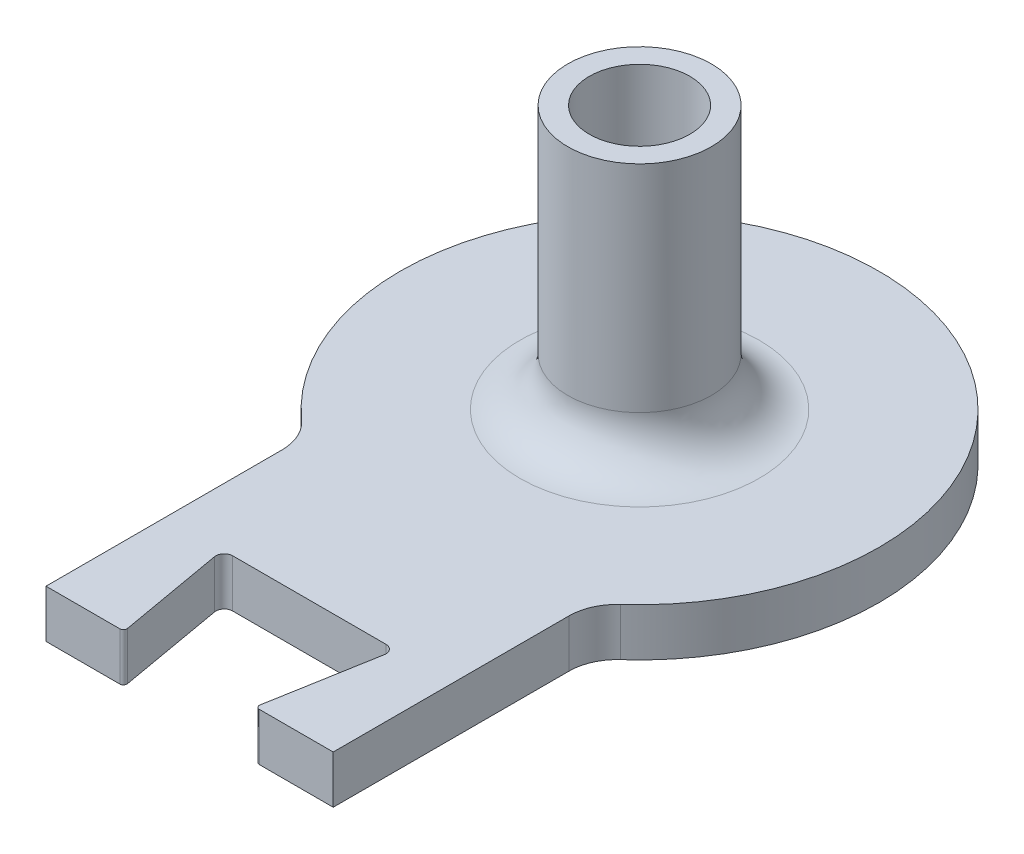
ISO-10303-21;
HEADER;
FILE_DESCRIPTION(('STEP AP214'),'2;1');
FILE_NAME('part.step','',(''),(''),'','','');
FILE_SCHEMA(('AUTOMOTIVE_DESIGN { 1 0 10303 214 1 1 1 1 }'));
ENDSEC;
DATA;
#1=APPLICATION_CONTEXT('core data for automotive mechanical design processes');
#2=APPLICATION_PROTOCOL_DEFINITION('international standard','automotive_design',2000,#1);
#3=PRODUCT_CONTEXT('',#1,'mechanical');
#4=PRODUCT('Part','Part','',(#3));
#5=PRODUCT_RELATED_PRODUCT_CATEGORY('part','',(#4));
#6=PRODUCT_DEFINITION_FORMATION('','',#4);
#7=PRODUCT_DEFINITION_CONTEXT('part definition',#1,'design');
#8=PRODUCT_DEFINITION('design','',#6,#7);
#9=PRODUCT_DEFINITION_SHAPE('','',#8);
#10=(LENGTH_UNIT() NAMED_UNIT(*) SI_UNIT(.MILLI.,.METRE.));
#11=(NAMED_UNIT(*) PLANE_ANGLE_UNIT() SI_UNIT($,.RADIAN.));
#12=(NAMED_UNIT(*) SI_UNIT($,.STERADIAN.) SOLID_ANGLE_UNIT());
#13=UNCERTAINTY_MEASURE_WITH_UNIT(LENGTH_MEASURE(1.E-05),#10,'distance_accuracy_value','');
#14=(GEOMETRIC_REPRESENTATION_CONTEXT(3) GLOBAL_UNCERTAINTY_ASSIGNED_CONTEXT((#13)) GLOBAL_UNIT_ASSIGNED_CONTEXT((#10,
#11,#12)) REPRESENTATION_CONTEXT('',''));
#15=CARTESIAN_POINT('',(0.,0.,0.));
#16=DIRECTION('',(0.,0.,1.));
#17=DIRECTION('',(1.,0.,0.));
#18=AXIS2_PLACEMENT_3D('',#15,#16,#17);
#19=CARTESIAN_POINT('',(0.,2.,0.));
#20=DIRECTION('',(0.,1.,0.));
#21=DIRECTION('',(0.,0.,1.));
#22=AXIS2_PLACEMENT_3D('',#19,#20,#21);
#23=PLANE('',#22);
#24=CARTESIAN_POINT('',(0.,2.,0.));
#25=DIRECTION('',(0.,1.,0.));
#26=DIRECTION('',(0.,0.,1.));
#27=AXIS2_PLACEMENT_3D('',#24,#25,#26);
#28=CIRCLE('',#27,5.);
#29=CARTESIAN_POINT('',(0.,2.,5.));
#30=VERTEX_POINT('',#29);
#31=EDGE_CURVE('E209',#30,#30,#28,.F.);
#32=ORIENTED_EDGE('',*,*,#31,.T.);
#33=EDGE_LOOP('',(#32));
#34=FACE_BOUND('',#33,.T.);
#35=DIRECTION('',(-0.173648177666934,0.,0.984807753012207));
#36=VECTOR('',#35,1.);
#37=CARTESIAN_POINT('',(2.70227505957538,2.,19.));
#38=LINE('',#37,#36);
#39=CARTESIAN_POINT('',(3.54674431540572,2.,14.2107768621834));
#40=VERTEX_POINT('',#39);
#41=CARTESIAN_POINT('',(2.76858233165438,2.,18.62395277335));
#42=VERTEX_POINT('',#41);
#43=EDGE_CURVE('E152',#40,#42,#38,.T.);
#44=ORIENTED_EDGE('',*,*,#43,.T.);
#45=CARTESIAN_POINT('',(2.91630349460621,2.,18.65));
#46=DIRECTION('',(0.,1.,0.));
#47=DIRECTION('',(0.,0.,1.));
#48=AXIS2_PLACEMENT_3D('',#45,#46,#47);
#49=CIRCLE('',#48,0.15);
#50=CARTESIAN_POINT('',(2.91630349460621,2.,18.8));
#51=VERTEX_POINT('',#50);
#52=EDGE_CURVE('E147',#42,#51,#49,.T.);
#53=ORIENTED_EDGE('',*,*,#52,.T.);
#54=DIRECTION('',(-1.,0.,0.));
#55=VECTOR('',#54,1.);
#56=CARTESIAN_POINT('',(-6.,2.,18.8));
#57=LINE('',#56,#55);
#58=CARTESIAN_POINT('',(6.,2.,18.8));
#59=VERTEX_POINT('',#58);
#60=EDGE_CURVE('E137',#59,#51,#57,.T.);
#61=ORIENTED_EDGE('',*,*,#60,.F.);
#62=DIRECTION('',(0.,0.,-1.));
#63=VECTOR('',#62,1.);
#64=CARTESIAN_POINT('',(6.,2.,19.));
#65=LINE('',#64,#63);
#66=CARTESIAN_POINT('',(6.,2.,8.94427190999916));
#67=VERTEX_POINT('',#66);
#68=EDGE_CURVE('E145',#59,#67,#65,.T.);
#69=ORIENTED_EDGE('',*,*,#68,.T.);
#70=CARTESIAN_POINT('',(8.,2.,8.94427190999916));
#71=DIRECTION('',(0.,1.,0.));
#72=DIRECTION('',(0.,0.,1.));
#73=AXIS2_PLACEMENT_3D('',#70,#71,#72);
#74=CIRCLE('',#73,2.);
#75=CARTESIAN_POINT('',(6.66666666666667,2.,7.4535599249993));
#76=VERTEX_POINT('',#75);
#77=EDGE_CURVE('E11',#67,#76,#74,.F.);
#78=ORIENTED_EDGE('',*,*,#77,.T.);
#79=CARTESIAN_POINT('',(0.,2.,0.));
#80=DIRECTION('',(0.,1.,0.));
#81=DIRECTION('',(0.,0.,1.));
#82=AXIS2_PLACEMENT_3D('',#79,#80,#81);
#83=CIRCLE('',#82,10.);
#84=CARTESIAN_POINT('',(-6.66666666666667,2.,7.4535599249993));
#85=VERTEX_POINT('',#84);
#86=EDGE_CURVE('E241',#76,#85,#83,.T.);
#87=ORIENTED_EDGE('',*,*,#86,.T.);
#88=CARTESIAN_POINT('',(-8.,2.,8.94427190999916));
#89=DIRECTION('',(0.,1.,0.));
#90=DIRECTION('',(0.,0.,1.));
#91=AXIS2_PLACEMENT_3D('',#88,#89,#90);
#92=CIRCLE('',#91,2.);
#93=CARTESIAN_POINT('',(-6.,2.,8.94427190999916));
#94=VERTEX_POINT('',#93);
#95=EDGE_CURVE('E224',#85,#94,#92,.F.);
#96=ORIENTED_EDGE('',*,*,#95,.T.);
#97=DIRECTION('',(0.,0.,1.));
#98=VECTOR('',#97,1.);
#99=CARTESIAN_POINT('',(-6.,2.,-6.));
#100=LINE('',#99,#98);
#101=CARTESIAN_POINT('',(-6.,2.,18.8));
#102=VERTEX_POINT('',#101);
#103=EDGE_CURVE('E173',#94,#102,#100,.T.);
#104=ORIENTED_EDGE('',*,*,#103,.T.);
#105=CARTESIAN_POINT('',(-2.91630349460621,2.,18.8));
#106=VERTEX_POINT('',#105);
#107=EDGE_CURVE('E148',#106,#102,#57,.T.);
#108=ORIENTED_EDGE('',*,*,#107,.F.);
#109=CARTESIAN_POINT('',(-2.91630349460621,2.,18.65));
#110=DIRECTION('',(0.,1.,0.));
#111=DIRECTION('',(0.,0.,1.));
#112=AXIS2_PLACEMENT_3D('',#109,#110,#111);
#113=CIRCLE('',#112,0.15);
#114=CARTESIAN_POINT('',(-2.76858233165438,2.,18.62395277335));
#115=VERTEX_POINT('',#114);
#116=EDGE_CURVE('E194',#106,#115,#113,.T.);
#117=ORIENTED_EDGE('',*,*,#116,.T.);
#118=DIRECTION('',(-0.173648177666935,0.,-0.984807753012207));
#119=VECTOR('',#118,1.);
#120=CARTESIAN_POINT('',(-2.70227505957538,2.,19.));
#121=LINE('',#120,#119);
#122=CARTESIAN_POINT('',(-3.54674431540572,2.,14.2107768621834));
#123=VERTEX_POINT('',#122);
#124=EDGE_CURVE('E252',#115,#123,#121,.T.);
#125=ORIENTED_EDGE('',*,*,#124,.T.);
#126=CARTESIAN_POINT('',(-3.20206160185145,2.,14.15));
#127=DIRECTION('',(0.,1.,0.));
#128=DIRECTION('',(0.,0.,1.));
#129=AXIS2_PLACEMENT_3D('',#126,#127,#128);
#130=CIRCLE('',#129,0.35);
#131=CARTESIAN_POINT('',(-3.20206160185145,2.,13.8));
#132=VERTEX_POINT('',#131);
#133=EDGE_CURVE('E189',#123,#132,#130,.F.);
#134=ORIENTED_EDGE('',*,*,#133,.T.);
#135=DIRECTION('',(1.,0.,0.));
#136=VECTOR('',#135,1.);
#137=CARTESIAN_POINT('',(-3.61917535925942,2.,13.8));
#138=LINE('',#137,#136);
#139=CARTESIAN_POINT('',(3.20206160185144,2.,13.8));
#140=VERTEX_POINT('',#139);
#141=EDGE_CURVE('E157',#132,#140,#138,.T.);
#142=ORIENTED_EDGE('',*,*,#141,.T.);
#143=CARTESIAN_POINT('',(3.20206160185145,2.,14.15));
#144=DIRECTION('',(0.,1.,0.));
#145=DIRECTION('',(0.,0.,1.));
#146=AXIS2_PLACEMENT_3D('',#143,#144,#145);
#147=CIRCLE('',#146,0.35);
#148=EDGE_CURVE('E184',#140,#40,#147,.F.);
#149=ORIENTED_EDGE('',*,*,#148,.T.);
#150=EDGE_LOOP('',(#44,#53,#61,#69,#78,#87,#96,#104,#108,#117,#125,#134,#142,#149));
#151=FACE_BOUND('',#150,.T.);
#152=ADVANCED_FACE('F33',(#34,#151),#23,.T.);
#153=CARTESIAN_POINT('',(-6.,2.,13.2915026221292));
#154=DIRECTION('',(1.,0.,0.));
#155=DIRECTION('',(0.,0.,-1.));
#156=AXIS2_PLACEMENT_3D('',#153,#154,#155);
#157=PLANE('',#156);
#158=ORIENTED_EDGE('',*,*,#103,.F.);
#159=DIRECTION('',(0.,1.,0.));
#160=VECTOR('',#159,1.);
#161=CARTESIAN_POINT('',(-6.,0.,8.94427190999916));
#162=LINE('',#161,#160);
#163=CARTESIAN_POINT('',(-6.,0.,8.94427190999916));
#164=VERTEX_POINT('',#163);
#165=EDGE_CURVE('E221',#94,#164,#162,.F.);
#166=ORIENTED_EDGE('',*,*,#165,.T.);
#167=DIRECTION('',(0.,0.,1.));
#168=VECTOR('',#167,1.);
#169=CARTESIAN_POINT('',(-6.,0.,13.2915026221292));
#170=LINE('',#169,#168);
#171=CARTESIAN_POINT('',(-6.,0.,18.8));
#172=VERTEX_POINT('',#171);
#173=EDGE_CURVE('E161',#164,#172,#170,.T.);
#174=ORIENTED_EDGE('',*,*,#173,.T.);
#175=DIRECTION('',(0.,1.,0.));
#176=VECTOR('',#175,1.);
#177=CARTESIAN_POINT('',(-6.,-2.,18.8));
#178=LINE('',#177,#176);
#179=EDGE_CURVE('E141',#172,#102,#178,.T.);
#180=ORIENTED_EDGE('',*,*,#179,.T.);
#181=EDGE_LOOP('',(#158,#166,#174,#180));
#182=FACE_BOUND('',#181,.T.);
#183=ADVANCED_FACE('F250',(#182),#157,.F.);
#184=CARTESIAN_POINT('',(6.,2.,13.2915026221292));
#185=DIRECTION('',(-1.,0.,0.));
#186=DIRECTION('',(0.,0.,1.));
#187=AXIS2_PLACEMENT_3D('',#184,#185,#186);
#188=PLANE('',#187);
#189=DIRECTION('',(0.,0.,-1.));
#190=VECTOR('',#189,1.);
#191=CARTESIAN_POINT('',(6.,0.,13.2915026221292));
#192=LINE('',#191,#190);
#193=CARTESIAN_POINT('',(6.,0.,18.8));
#194=VERTEX_POINT('',#193);
#195=CARTESIAN_POINT('',(6.,0.,8.94427190999916));
#196=VERTEX_POINT('',#195);
#197=EDGE_CURVE('E172',#194,#196,#192,.T.);
#198=ORIENTED_EDGE('',*,*,#197,.T.);
#199=DIRECTION('',(0.,1.,0.));
#200=VECTOR('',#199,1.);
#201=CARTESIAN_POINT('',(6.,2.,8.94427190999916));
#202=LINE('',#201,#200);
#203=EDGE_CURVE('E54',#196,#67,#202,.T.);
#204=ORIENTED_EDGE('',*,*,#203,.T.);
#205=ORIENTED_EDGE('',*,*,#68,.F.);
#206=DIRECTION('',(0.,1.,0.));
#207=VECTOR('',#206,1.);
#208=CARTESIAN_POINT('',(6.,-2.,18.8));
#209=LINE('',#208,#207);
#210=EDGE_CURVE('E134',#194,#59,#209,.T.);
#211=ORIENTED_EDGE('',*,*,#210,.F.);
#212=EDGE_LOOP('',(#198,#204,#205,#211));
#213=FACE_BOUND('',#212,.T.);
#214=ADVANCED_FACE('F150',(#213),#188,.F.);
#215=CARTESIAN_POINT('',(0.,2.,0.));
#216=DIRECTION('',(0.,1.,0.));
#217=DIRECTION('',(0.,0.,1.));
#218=AXIS2_PLACEMENT_3D('',#215,#216,#217);
#219=CIRCLE('',#218,2.1);
#220=CARTESIAN_POINT('',(0.,2.,-2.1));
#221=VERTEX_POINT('',#220);
#222=EDGE_CURVE('E208',#221,#221,#219,.F.);
#223=ORIENTED_EDGE('',*,*,#222,.F.);
#224=EDGE_LOOP('',(#223));
#225=FACE_BOUND('',#224,.T.);
#226=CARTESIAN_POINT('',(0.,2.,0.));
#227=DIRECTION('',(0.,1.,0.));
#228=DIRECTION('',(0.,0.,1.));
#229=AXIS2_PLACEMENT_3D('',#226,#227,#228);
#230=CIRCLE('',#229,0.25);
#231=CARTESIAN_POINT('',(0.,2.,0.25));
#232=VERTEX_POINT('',#231);
#233=EDGE_CURVE('E164',#232,#232,#230,.T.);
#234=ORIENTED_EDGE('',*,*,#233,.F.);
#235=EDGE_LOOP('',(#234));
#236=FACE_BOUND('',#235,.T.);
#237=ADVANCED_FACE('F293',(#225,#236),#23,.T.);
#238=CARTESIAN_POINT('',(0.,0.,0.));
#239=DIRECTION('',(0.,1.,0.));
#240=DIRECTION('',(0.,0.,1.));
#241=AXIS2_PLACEMENT_3D('',#238,#239,#240);
#242=PLANE('',#241);
#243=CARTESIAN_POINT('',(0.,0.,0.));
#244=DIRECTION('',(0.,1.,0.));
#245=DIRECTION('',(0.,0.,1.));
#246=AXIS2_PLACEMENT_3D('',#243,#244,#245);
#247=CIRCLE('',#246,0.25);
#248=CARTESIAN_POINT('',(0.,0.,0.25));
#249=VERTEX_POINT('',#248);
#250=EDGE_CURVE('E256',#249,#249,#247,.T.);
#251=ORIENTED_EDGE('',*,*,#250,.T.);
#252=EDGE_LOOP('',(#251));
#253=FACE_BOUND('',#252,.T.);
#254=DIRECTION('',(-1.,0.,0.));
#255=VECTOR('',#254,1.);
#256=CARTESIAN_POINT('',(0.,0.,18.8));
#257=LINE('',#256,#255);
#258=CARTESIAN_POINT('',(2.91630349460621,0.,18.8));
#259=VERTEX_POINT('',#258);
#260=EDGE_CURVE('E140',#194,#259,#257,.T.);
#261=ORIENTED_EDGE('',*,*,#260,.T.);
#262=CARTESIAN_POINT('',(2.91630349460621,0.,18.65));
#263=DIRECTION('',(0.,1.,0.));
#264=DIRECTION('',(0.,0.,1.));
#265=AXIS2_PLACEMENT_3D('',#262,#263,#264);
#266=CIRCLE('',#265,0.15);
#267=CARTESIAN_POINT('',(2.76858233165438,0.,18.62395277335));
#268=VERTEX_POINT('',#267);
#269=EDGE_CURVE('E201',#259,#268,#266,.F.);
#270=ORIENTED_EDGE('',*,*,#269,.T.);
#271=DIRECTION('',(-0.173648177666934,0.,0.984807753012207));
#272=VECTOR('',#271,1.);
#273=CARTESIAN_POINT('',(2.70227505957538,0.,19.));
#274=LINE('',#273,#272);
#275=CARTESIAN_POINT('',(3.54674431540572,0.,14.2107768621834));
#276=VERTEX_POINT('',#275);
#277=EDGE_CURVE('E169',#276,#268,#274,.T.);
#278=ORIENTED_EDGE('',*,*,#277,.F.);
#279=CARTESIAN_POINT('',(3.20206160185145,0.,14.15));
#280=DIRECTION('',(0.,1.,0.));
#281=DIRECTION('',(0.,0.,1.));
#282=AXIS2_PLACEMENT_3D('',#279,#280,#281);
#283=CIRCLE('',#282,0.35);
#284=CARTESIAN_POINT('',(3.20206160185145,0.,13.8));
#285=VERTEX_POINT('',#284);
#286=EDGE_CURVE('E182',#276,#285,#283,.T.);
#287=ORIENTED_EDGE('',*,*,#286,.T.);
#288=DIRECTION('',(1.,0.,0.));
#289=VECTOR('',#288,1.);
#290=CARTESIAN_POINT('',(3.61917535925942,0.,13.8));
#291=LINE('',#290,#289);
#292=CARTESIAN_POINT('',(-3.20206160185144,0.,13.8));
#293=VERTEX_POINT('',#292);
#294=EDGE_CURVE('E166',#293,#285,#291,.T.);
#295=ORIENTED_EDGE('',*,*,#294,.F.);
#296=CARTESIAN_POINT('',(-3.20206160185145,0.,14.15));
#297=DIRECTION('',(0.,1.,0.));
#298=DIRECTION('',(0.,0.,1.));
#299=AXIS2_PLACEMENT_3D('',#296,#297,#298);
#300=CIRCLE('',#299,0.35);
#301=CARTESIAN_POINT('',(-3.54674431540572,0.,14.2107768621834));
#302=VERTEX_POINT('',#301);
#303=EDGE_CURVE('E186',#293,#302,#300,.T.);
#304=ORIENTED_EDGE('',*,*,#303,.T.);
#305=DIRECTION('',(-0.173648177666935,0.,-0.984807753012207));
#306=VECTOR('',#305,1.);
#307=CARTESIAN_POINT('',(-2.70227505957538,0.,19.));
#308=LINE('',#307,#306);
#309=CARTESIAN_POINT('',(-2.76858233165438,0.,18.62395277335));
#310=VERTEX_POINT('',#309);
#311=EDGE_CURVE('E163',#310,#302,#308,.T.);
#312=ORIENTED_EDGE('',*,*,#311,.F.);
#313=CARTESIAN_POINT('',(-2.91630349460621,0.,18.65));
#314=DIRECTION('',(0.,1.,0.));
#315=DIRECTION('',(0.,0.,1.));
#316=AXIS2_PLACEMENT_3D('',#313,#314,#315);
#317=CIRCLE('',#316,0.15);
#318=CARTESIAN_POINT('',(-2.91630349460621,0.,18.8));
#319=VERTEX_POINT('',#318);
#320=EDGE_CURVE('E199',#310,#319,#317,.F.);
#321=ORIENTED_EDGE('',*,*,#320,.T.);
#322=EDGE_CURVE('E242',#319,#172,#257,.T.);
#323=ORIENTED_EDGE('',*,*,#322,.T.);
#324=ORIENTED_EDGE('',*,*,#173,.F.);
#325=CARTESIAN_POINT('',(-8.,0.,8.94427190999916));
#326=DIRECTION('',(0.,1.,0.));
#327=DIRECTION('',(0.,0.,1.));
#328=AXIS2_PLACEMENT_3D('',#325,#326,#327);
#329=CIRCLE('',#328,2.);
#330=CARTESIAN_POINT('',(-6.66666666666667,0.,7.4535599249993));
#331=VERTEX_POINT('',#330);
#332=EDGE_CURVE('E226',#164,#331,#329,.T.);
#333=ORIENTED_EDGE('',*,*,#332,.T.);
#334=CARTESIAN_POINT('',(0.,0.,0.));
#335=DIRECTION('',(0.,1.,0.));
#336=DIRECTION('',(0.,0.,1.));
#337=AXIS2_PLACEMENT_3D('',#334,#335,#336);
#338=CIRCLE('',#337,10.);
#339=CARTESIAN_POINT('',(6.66666666666667,0.,7.4535599249993));
#340=VERTEX_POINT('',#339);
#341=EDGE_CURVE('E231',#340,#331,#338,.T.);
#342=ORIENTED_EDGE('',*,*,#341,.F.);
#343=CARTESIAN_POINT('',(8.,0.,8.94427190999916));
#344=DIRECTION('',(0.,1.,0.));
#345=DIRECTION('',(0.,0.,1.));
#346=AXIS2_PLACEMENT_3D('',#343,#344,#345);
#347=CIRCLE('',#346,2.);
#348=EDGE_CURVE('E41',#340,#196,#347,.T.);
#349=ORIENTED_EDGE('',*,*,#348,.T.);
#350=ORIENTED_EDGE('',*,*,#197,.F.);
#351=EDGE_LOOP('',(#261,#270,#278,#287,#295,#304,#312,#321,#323,#324,#333,#342,#349,#350));
#352=FACE_BOUND('',#351,.T.);
#353=ADVANCED_FACE('F230',(#253,#352),#242,.F.);
#354=CARTESIAN_POINT('',(-2.70227505957538,2.,19.));
#355=DIRECTION('',(-0.984807753012207,0.,0.173648177666935));
#356=DIRECTION('',(0.173648177666935,0.,0.984807753012207));
#357=AXIS2_PLACEMENT_3D('',#354,#355,#356);
#358=PLANE('',#357);
#359=ORIENTED_EDGE('',*,*,#124,.F.);
#360=DIRECTION('',(0.,-1.,0.));
#361=VECTOR('',#360,1.);
#362=CARTESIAN_POINT('',(-2.76858233165438,2.,18.62395277335));
#363=LINE('',#362,#361);
#364=EDGE_CURVE('E203',#115,#310,#363,.T.);
#365=ORIENTED_EDGE('',*,*,#364,.T.);
#366=ORIENTED_EDGE('',*,*,#311,.T.);
#367=DIRECTION('',(0.,-1.,0.));
#368=VECTOR('',#367,1.);
#369=CARTESIAN_POINT('',(-3.54674431540572,2.,14.2107768621834));
#370=LINE('',#369,#368);
#371=EDGE_CURVE('E179',#302,#123,#370,.F.);
#372=ORIENTED_EDGE('',*,*,#371,.T.);
#373=EDGE_LOOP('',(#359,#365,#366,#372));
#374=FACE_BOUND('',#373,.T.);
#375=ADVANCED_FACE('F306',(#374),#358,.F.);
#376=CARTESIAN_POINT('',(3.61917535925942,2.,13.8));
#377=DIRECTION('',(0.,0.,-1.));
#378=DIRECTION('',(-1.,0.,0.));
#379=AXIS2_PLACEMENT_3D('',#376,#377,#378);
#380=PLANE('',#379);
#381=ORIENTED_EDGE('',*,*,#294,.T.);
#382=DIRECTION('',(0.,-1.,0.));
#383=VECTOR('',#382,1.);
#384=CARTESIAN_POINT('',(3.20206160185145,2.,13.8));
#385=LINE('',#384,#383);
#386=EDGE_CURVE('E177',#285,#140,#385,.F.);
#387=ORIENTED_EDGE('',*,*,#386,.T.);
#388=ORIENTED_EDGE('',*,*,#141,.F.);
#389=DIRECTION('',(0.,-1.,0.));
#390=VECTOR('',#389,1.);
#391=CARTESIAN_POINT('',(-3.20206160185145,0.,13.8));
#392=LINE('',#391,#390);
#393=EDGE_CURVE('E155',#132,#293,#392,.T.);
#394=ORIENTED_EDGE('',*,*,#393,.T.);
#395=EDGE_LOOP('',(#381,#387,#388,#394));
#396=FACE_BOUND('',#395,.T.);
#397=ADVANCED_FACE('F351',(#396),#380,.F.);
#398=CARTESIAN_POINT('',(2.70227505957538,2.,19.));
#399=DIRECTION('',(0.984807753012207,0.,0.173648177666934));
#400=DIRECTION('',(0.173648177666934,0.,-0.984807753012207));
#401=AXIS2_PLACEMENT_3D('',#398,#399,#400);
#402=PLANE('',#401);
#403=ORIENTED_EDGE('',*,*,#277,.T.);
#404=DIRECTION('',(0.,1.,0.));
#405=VECTOR('',#404,1.);
#406=CARTESIAN_POINT('',(2.76858233165438,2.,18.62395277335));
#407=LINE('',#406,#405);
#408=EDGE_CURVE('E191',#268,#42,#407,.T.);
#409=ORIENTED_EDGE('',*,*,#408,.T.);
#410=ORIENTED_EDGE('',*,*,#43,.F.);
#411=DIRECTION('',(0.,-1.,0.));
#412=VECTOR('',#411,1.);
#413=CARTESIAN_POINT('',(3.54674431540572,0.,14.2107768621834));
#414=LINE('',#413,#412);
#415=EDGE_CURVE('E151',#40,#276,#414,.T.);
#416=ORIENTED_EDGE('',*,*,#415,.T.);
#417=EDGE_LOOP('',(#403,#409,#410,#416));
#418=FACE_BOUND('',#417,.T.);
#419=ADVANCED_FACE('F271',(#418),#402,.F.);
#420=CARTESIAN_POINT('',(0.,2.,0.));
#421=DIRECTION('',(0.,-1.,0.));
#422=DIRECTION('',(0.,0.,-1.));
#423=AXIS2_PLACEMENT_3D('',#420,#421,#422);
#424=CYLINDRICAL_SURFACE('',#423,0.25);
#425=ORIENTED_EDGE('',*,*,#233,.T.);
#426=EDGE_LOOP('',(#425));
#427=FACE_BOUND('',#426,.T.);
#428=ORIENTED_EDGE('',*,*,#250,.F.);
#429=EDGE_LOOP('',(#428));
#430=FACE_BOUND('',#429,.T.);
#431=ADVANCED_FACE('F346',(#427,#430),#424,.F.);
#432=CARTESIAN_POINT('',(0.,2.,0.));
#433=DIRECTION('',(0.,-1.,0.));
#434=DIRECTION('',(0.,0.,-1.));
#435=AXIS2_PLACEMENT_3D('',#432,#433,#434);
#436=CYLINDRICAL_SURFACE('',#435,10.);
#437=ORIENTED_EDGE('',*,*,#341,.T.);
#438=DIRECTION('',(0.,-1.,0.));
#439=VECTOR('',#438,1.);
#440=CARTESIAN_POINT('',(-6.66666666666667,2.,7.4535599249993));
#441=LINE('',#440,#439);
#442=EDGE_CURVE('E218',#331,#85,#441,.F.);
#443=ORIENTED_EDGE('',*,*,#442,.T.);
#444=ORIENTED_EDGE('',*,*,#86,.F.);
#445=DIRECTION('',(0.,-1.,0.));
#446=VECTOR('',#445,1.);
#447=CARTESIAN_POINT('',(6.66666666666667,2.,7.4535599249993));
#448=LINE('',#447,#446);
#449=EDGE_CURVE('E215',#76,#340,#448,.T.);
#450=ORIENTED_EDGE('',*,*,#449,.T.);
#451=EDGE_LOOP('',(#437,#443,#444,#450));
#452=FACE_BOUND('',#451,.T.);
#453=ADVANCED_FACE('F237',(#452),#436,.T.);
#454=CARTESIAN_POINT('',(-6.,-2.,18.8));
#455=DIRECTION('',(0.,0.,-1.));
#456=DIRECTION('',(-1.,0.,0.));
#457=AXIS2_PLACEMENT_3D('',#454,#455,#456);
#458=PLANE('',#457);
#459=ORIENTED_EDGE('',*,*,#60,.T.);
#460=DIRECTION('',(0.,1.,0.));
#461=VECTOR('',#460,1.);
#462=CARTESIAN_POINT('',(2.91630349460621,-2.,18.8));
#463=LINE('',#462,#461);
#464=EDGE_CURVE('E197',#51,#259,#463,.F.);
#465=ORIENTED_EDGE('',*,*,#464,.T.);
#466=ORIENTED_EDGE('',*,*,#260,.F.);
#467=ORIENTED_EDGE('',*,*,#210,.T.);
#468=EDGE_LOOP('',(#459,#465,#466,#467));
#469=FACE_BOUND('',#468,.T.);
#470=ADVANCED_FACE('F136',(#469),#458,.F.);
#471=ORIENTED_EDGE('',*,*,#322,.F.);
#472=DIRECTION('',(0.,-1.,0.));
#473=VECTOR('',#472,1.);
#474=CARTESIAN_POINT('',(-2.91630349460621,-2.,18.8));
#475=LINE('',#474,#473);
#476=EDGE_CURVE('E206',#319,#106,#475,.F.);
#477=ORIENTED_EDGE('',*,*,#476,.T.);
#478=ORIENTED_EDGE('',*,*,#107,.T.);
#479=ORIENTED_EDGE('',*,*,#179,.F.);
#480=EDGE_LOOP('',(#471,#477,#478,#479));
#481=FACE_BOUND('',#480,.T.);
#482=ADVANCED_FACE('F341',(#481),#458,.F.);
#483=CARTESIAN_POINT('',(3.20206160185145,2.,14.15));
#484=DIRECTION('',(0.,1.,0.));
#485=DIRECTION('',(0.,0.,1.));
#486=AXIS2_PLACEMENT_3D('',#483,#484,#485);
#487=CYLINDRICAL_SURFACE('',#486,0.35);
#488=ORIENTED_EDGE('',*,*,#148,.F.);
#489=ORIENTED_EDGE('',*,*,#386,.F.);
#490=ORIENTED_EDGE('',*,*,#286,.F.);
#491=ORIENTED_EDGE('',*,*,#415,.F.);
#492=EDGE_LOOP('',(#488,#489,#490,#491));
#493=FACE_BOUND('',#492,.T.);
#494=ADVANCED_FACE('F268',(#493),#487,.F.);
#495=CARTESIAN_POINT('',(-3.20206160185145,2.,14.15));
#496=DIRECTION('',(0.,1.,0.));
#497=DIRECTION('',(0.,0.,1.));
#498=AXIS2_PLACEMENT_3D('',#495,#496,#497);
#499=CYLINDRICAL_SURFACE('',#498,0.35);
#500=ORIENTED_EDGE('',*,*,#133,.F.);
#501=ORIENTED_EDGE('',*,*,#371,.F.);
#502=ORIENTED_EDGE('',*,*,#303,.F.);
#503=ORIENTED_EDGE('',*,*,#393,.F.);
#504=EDGE_LOOP('',(#500,#501,#502,#503));
#505=FACE_BOUND('',#504,.T.);
#506=ADVANCED_FACE('F279',(#505),#499,.F.);
#507=CARTESIAN_POINT('',(2.91630349460621,2.,18.65));
#508=DIRECTION('',(0.,1.,0.));
#509=DIRECTION('',(0.,0.,1.));
#510=AXIS2_PLACEMENT_3D('',#507,#508,#509);
#511=CYLINDRICAL_SURFACE('',#510,0.15);
#512=ORIENTED_EDGE('',*,*,#269,.F.);
#513=ORIENTED_EDGE('',*,*,#464,.F.);
#514=ORIENTED_EDGE('',*,*,#52,.F.);
#515=ORIENTED_EDGE('',*,*,#408,.F.);
#516=EDGE_LOOP('',(#512,#513,#514,#515));
#517=FACE_BOUND('',#516,.T.);
#518=ADVANCED_FACE('F276',(#517),#511,.T.);
#519=CARTESIAN_POINT('',(-2.91630349460621,2.,18.65));
#520=DIRECTION('',(0.,-1.,0.));
#521=DIRECTION('',(0.,0.,-1.));
#522=AXIS2_PLACEMENT_3D('',#519,#520,#521);
#523=CYLINDRICAL_SURFACE('',#522,0.15);
#524=ORIENTED_EDGE('',*,*,#116,.F.);
#525=ORIENTED_EDGE('',*,*,#476,.F.);
#526=ORIENTED_EDGE('',*,*,#320,.F.);
#527=ORIENTED_EDGE('',*,*,#364,.F.);
#528=EDGE_LOOP('',(#524,#525,#526,#527));
#529=FACE_BOUND('',#528,.T.);
#530=ADVANCED_FACE('F278',(#529),#523,.T.);
#531=CARTESIAN_POINT('',(0.,13.,0.));
#532=DIRECTION('',(0.,1.,0.));
#533=DIRECTION('',(0.,0.,1.));
#534=AXIS2_PLACEMENT_3D('',#531,#532,#533);
#535=PLANE('',#534);
#536=CARTESIAN_POINT('',(0.,13.,0.));
#537=DIRECTION('',(0.,1.,0.));
#538=DIRECTION('',(0.,0.,1.));
#539=AXIS2_PLACEMENT_3D('',#536,#537,#538);
#540=CIRCLE('',#539,3.);
#541=CARTESIAN_POINT('',(0.,13.,-3.));
#542=VERTEX_POINT('',#541);
#543=EDGE_CURVE('E321',#542,#542,#540,.T.);
#544=ORIENTED_EDGE('',*,*,#543,.T.);
#545=EDGE_LOOP('',(#544));
#546=FACE_BOUND('',#545,.T.);
#547=CARTESIAN_POINT('',(0.,13.,0.));
#548=DIRECTION('',(0.,1.,0.));
#549=DIRECTION('',(0.,0.,1.));
#550=AXIS2_PLACEMENT_3D('',#547,#548,#549);
#551=CIRCLE('',#550,2.1);
#552=CARTESIAN_POINT('',(0.,13.,-2.1));
#553=VERTEX_POINT('',#552);
#554=EDGE_CURVE('E324',#553,#553,#551,.T.);
#555=ORIENTED_EDGE('',*,*,#554,.F.);
#556=EDGE_LOOP('',(#555));
#557=FACE_BOUND('',#556,.T.);
#558=ADVANCED_FACE('F285',(#546,#557),#535,.T.);
#559=CARTESIAN_POINT('',(0.,13.,0.));
#560=DIRECTION('',(0.,-1.,0.));
#561=DIRECTION('',(0.,0.,-1.));
#562=AXIS2_PLACEMENT_3D('',#559,#560,#561);
#563=CYLINDRICAL_SURFACE('',#562,3.);
#564=CARTESIAN_POINT('',(0.,4.,0.));
#565=DIRECTION('',(0.,1.,0.));
#566=DIRECTION('',(0.,0.,1.));
#567=AXIS2_PLACEMENT_3D('',#564,#565,#566);
#568=CIRCLE('',#567,3.);
#569=CARTESIAN_POINT('',(0.,4.,-3.));
#570=VERTEX_POINT('',#569);
#571=EDGE_CURVE('E212',#570,#570,#568,.T.);
#572=CARTESIAN_POINT('',(0.,4.,-3.));
#573=CARTESIAN_POINT('',(0.,4.09375,-3.));
#574=CARTESIAN_POINT('',(0.,4.1875,-3.));
#575=CARTESIAN_POINT('',(0.,4.375,-3.));
#576=CARTESIAN_POINT('',(0.,4.46875,-3.));
#577=CARTESIAN_POINT('',(0.,4.65625,-3.));
#578=CARTESIAN_POINT('',(0.,4.75,-3.));
#579=CARTESIAN_POINT('',(0.,4.9375,-3.));
#580=CARTESIAN_POINT('',(0.,5.03125,-3.));
#581=CARTESIAN_POINT('',(0.,5.21875,-3.));
#582=CARTESIAN_POINT('',(0.,5.3125,-3.));
#583=CARTESIAN_POINT('',(0.,5.5,-3.));
#584=CARTESIAN_POINT('',(0.,5.59375,-3.));
#585=CARTESIAN_POINT('',(0.,5.78125,-3.));
#586=CARTESIAN_POINT('',(0.,5.875,-3.));
#587=CARTESIAN_POINT('',(0.,6.0625,-3.));
#588=CARTESIAN_POINT('',(0.,6.15625,-3.));
#589=CARTESIAN_POINT('',(0.,6.34375,-3.));
#590=CARTESIAN_POINT('',(0.,6.4375,-3.));
#591=CARTESIAN_POINT('',(0.,6.625,-3.));
#592=CARTESIAN_POINT('',(0.,6.71875,-3.));
#593=CARTESIAN_POINT('',(0.,6.90625,-3.));
#594=CARTESIAN_POINT('',(0.,7.,-3.));
#595=CARTESIAN_POINT('',(0.,7.1875,-3.));
#596=CARTESIAN_POINT('',(0.,7.28125,-3.));
#597=CARTESIAN_POINT('',(0.,7.46875,-3.));
#598=CARTESIAN_POINT('',(0.,7.5625,-3.));
#599=CARTESIAN_POINT('',(0.,7.75,-3.));
#600=CARTESIAN_POINT('',(0.,7.84375,-3.));
#601=CARTESIAN_POINT('',(0.,8.03125,-3.));
#602=CARTESIAN_POINT('',(0.,8.125,-3.));
#603=CARTESIAN_POINT('',(0.,8.3125,-3.));
#604=CARTESIAN_POINT('',(0.,8.40625,-3.));
#605=CARTESIAN_POINT('',(0.,8.59375,-3.));
#606=CARTESIAN_POINT('',(0.,8.6875,-3.));
#607=CARTESIAN_POINT('',(0.,8.875,-3.));
#608=CARTESIAN_POINT('',(0.,8.96875,-3.));
#609=CARTESIAN_POINT('',(0.,9.15625,-3.));
#610=CARTESIAN_POINT('',(0.,9.25,-3.));
#611=CARTESIAN_POINT('',(0.,9.4375,-3.));
#612=CARTESIAN_POINT('',(0.,9.53125,-3.));
#613=CARTESIAN_POINT('',(0.,9.71875,-3.));
#614=CARTESIAN_POINT('',(0.,9.8125,-3.));
#615=CARTESIAN_POINT('',(0.,10.,-3.));
#616=CARTESIAN_POINT('',(0.,10.09375,-3.));
#617=CARTESIAN_POINT('',(0.,10.28125,-3.));
#618=CARTESIAN_POINT('',(0.,10.375,-3.));
#619=CARTESIAN_POINT('',(0.,10.5625,-3.));
#620=CARTESIAN_POINT('',(0.,10.65625,-3.));
#621=CARTESIAN_POINT('',(0.,10.84375,-3.));
#622=CARTESIAN_POINT('',(0.,10.9375,-3.));
#623=CARTESIAN_POINT('',(0.,11.125,-3.));
#624=CARTESIAN_POINT('',(0.,11.21875,-3.));
#625=CARTESIAN_POINT('',(0.,11.40625,-3.));
#626=CARTESIAN_POINT('',(0.,11.5,-3.));
#627=CARTESIAN_POINT('',(0.,11.6875,-3.));
#628=CARTESIAN_POINT('',(0.,11.78125,-3.));
#629=CARTESIAN_POINT('',(0.,11.96875,-3.));
#630=CARTESIAN_POINT('',(0.,12.0625,-3.));
#631=CARTESIAN_POINT('',(0.,12.25,-3.));
#632=CARTESIAN_POINT('',(0.,12.34375,-3.));
#633=CARTESIAN_POINT('',(0.,12.53125,-3.));
#634=CARTESIAN_POINT('',(0.,12.625,-3.));
#635=CARTESIAN_POINT('',(0.,12.8125,-3.));
#636=CARTESIAN_POINT('',(0.,12.90625,-3.));
#637=CARTESIAN_POINT('',(0.,13.,-3.));
#638=B_SPLINE_CURVE_WITH_KNOTS('',3,(#572,#573,#574,#575,#576,#577,#578,#579,#580,#581,#582,
#583,#584,#585,#586,#587,#588,#589,#590,#591,#592,#593,#594,#595,#596,#597,#598,#599,#600,#601,
#602,#603,#604,#605,#606,#607,#608,#609,#610,#611,#612,#613,#614,#615,#616,#617,#618,#619,#620,
#621,#622,#623,#624,#625,#626,#627,#628,#629,#630,#631,#632,#633,#634,#635,#636,#637),
.UNSPECIFIED.,.F.,.F.,(4,2,2,2,2,2,2,2,2,2,2,2,2,2,2,2,2,2,2,2,2,2,2,2,2,2,2,2,2,2,2,2,4),(0.,
0.28125,0.5625,0.843750000000001,1.125,1.40625,1.6875,1.96875,2.25,2.53125,2.8125,3.09375,3.375,
3.65625,3.9375,4.21875,4.5,4.78125,5.0625,5.34375,5.625,5.90625,6.1875,6.46875,6.75,7.03125,
7.3125,7.59375,7.875,8.15625,8.4375,8.71875,9.),.UNSPECIFIED.);
#639=EDGE_CURVE('BSEAM331',#570,#542,#638,.T.);
#640=ORIENTED_EDGE('',*,*,#571,.T.);
#641=ORIENTED_EDGE('',*,*,#543,.F.);
#642=ORIENTED_EDGE('',*,*,#639,.T.);
#643=ORIENTED_EDGE('',*,*,#639,.F.);
#644=EDGE_LOOP('',(#640,#642,#641,#643));
#645=FACE_BOUND('',#644,.T.);
#646=ADVANCED_FACE('F331',(#645),#563,.T.);
#647=CARTESIAN_POINT('',(0.,13.,0.));
#648=DIRECTION('',(0.,-1.,0.));
#649=DIRECTION('',(0.,0.,-1.));
#650=AXIS2_PLACEMENT_3D('',#647,#648,#649);
#651=CYLINDRICAL_SURFACE('',#650,2.1);
#652=CARTESIAN_POINT('',(0.,2.,-2.1));
#653=CARTESIAN_POINT('',(0.,2.11458333333333,-2.1));
#654=CARTESIAN_POINT('',(0.,2.22916666666667,-2.1));
#655=CARTESIAN_POINT('',(0.,2.45833333333333,-2.1));
#656=CARTESIAN_POINT('',(0.,2.57291666666667,-2.1));
#657=CARTESIAN_POINT('',(0.,2.80208333333333,-2.1));
#658=CARTESIAN_POINT('',(0.,2.91666666666667,-2.1));
#659=CARTESIAN_POINT('',(0.,3.14583333333333,-2.1));
#660=CARTESIAN_POINT('',(0.,3.26041666666666,-2.1));
#661=CARTESIAN_POINT('',(0.,3.48958333333333,-2.1));
#662=CARTESIAN_POINT('',(0.,3.60416666666666,-2.1));
#663=CARTESIAN_POINT('',(0.,3.83333333333333,-2.1));
#664=CARTESIAN_POINT('',(0.,3.94791666666666,-2.1));
#665=CARTESIAN_POINT('',(0.,4.17708333333333,-2.1));
#666=CARTESIAN_POINT('',(0.,4.29166666666667,-2.1));
#667=CARTESIAN_POINT('',(0.,4.52083333333333,-2.1));
#668=CARTESIAN_POINT('',(0.,4.63541666666667,-2.1));
#669=CARTESIAN_POINT('',(0.,4.86458333333333,-2.1));
#670=CARTESIAN_POINT('',(0.,4.97916666666666,-2.1));
#671=CARTESIAN_POINT('',(0.,5.20833333333333,-2.1));
#672=CARTESIAN_POINT('',(0.,5.32291666666666,-2.1));
#673=CARTESIAN_POINT('',(0.,5.55208333333333,-2.1));
#674=CARTESIAN_POINT('',(0.,5.66666666666666,-2.1));
#675=CARTESIAN_POINT('',(0.,5.89583333333333,-2.1));
#676=CARTESIAN_POINT('',(0.,6.01041666666666,-2.1));
#677=CARTESIAN_POINT('',(0.,6.23958333333333,-2.1));
#678=CARTESIAN_POINT('',(0.,6.35416666666666,-2.1));
#679=CARTESIAN_POINT('',(0.,6.58333333333333,-2.1));
#680=CARTESIAN_POINT('',(0.,6.69791666666666,-2.1));
#681=CARTESIAN_POINT('',(0.,6.92708333333333,-2.1));
#682=CARTESIAN_POINT('',(0.,7.04166666666667,-2.1));
#683=CARTESIAN_POINT('',(0.,7.27083333333333,-2.1));
#684=CARTESIAN_POINT('',(0.,7.38541666666666,-2.1));
#685=CARTESIAN_POINT('',(0.,7.61458333333333,-2.1));
#686=CARTESIAN_POINT('',(0.,7.72916666666666,-2.1));
#687=CARTESIAN_POINT('',(0.,7.95833333333333,-2.1));
#688=CARTESIAN_POINT('',(0.,8.07291666666666,-2.1));
#689=CARTESIAN_POINT('',(0.,8.30208333333333,-2.1));
#690=CARTESIAN_POINT('',(0.,8.41666666666666,-2.1));
#691=CARTESIAN_POINT('',(0.,8.64583333333333,-2.1));
#692=CARTESIAN_POINT('',(0.,8.76041666666666,-2.1));
#693=CARTESIAN_POINT('',(0.,8.98958333333333,-2.1));
#694=CARTESIAN_POINT('',(0.,9.10416666666666,-2.1));
#695=CARTESIAN_POINT('',(0.,9.33333333333333,-2.1));
#696=CARTESIAN_POINT('',(0.,9.44791666666667,-2.1));
#697=CARTESIAN_POINT('',(0.,9.67708333333333,-2.1));
#698=CARTESIAN_POINT('',(0.,9.79166666666666,-2.1));
#699=CARTESIAN_POINT('',(0.,10.0208333333333,-2.1));
#700=CARTESIAN_POINT('',(0.,10.1354166666667,-2.1));
#701=CARTESIAN_POINT('',(0.,10.3645833333333,-2.1));
#702=CARTESIAN_POINT('',(0.,10.4791666666667,-2.1));
#703=CARTESIAN_POINT('',(0.,10.7083333333333,-2.1));
#704=CARTESIAN_POINT('',(0.,10.8229166666667,-2.1));
#705=CARTESIAN_POINT('',(0.,11.0520833333333,-2.1));
#706=CARTESIAN_POINT('',(0.,11.1666666666667,-2.1));
#707=CARTESIAN_POINT('',(0.,11.3958333333333,-2.1));
#708=CARTESIAN_POINT('',(0.,11.5104166666667,-2.1));
#709=CARTESIAN_POINT('',(0.,11.7395833333333,-2.1));
#710=CARTESIAN_POINT('',(0.,11.8541666666667,-2.1));
#711=CARTESIAN_POINT('',(0.,12.0833333333333,-2.1));
#712=CARTESIAN_POINT('',(0.,12.1979166666667,-2.1));
#713=CARTESIAN_POINT('',(0.,12.4270833333333,-2.1));
#714=CARTESIAN_POINT('',(0.,12.5416666666667,-2.1));
#715=CARTESIAN_POINT('',(0.,12.7708333333333,-2.1));
#716=CARTESIAN_POINT('',(0.,12.8854166666667,-2.1));
#717=CARTESIAN_POINT('',(0.,13.,-2.1));
#718=B_SPLINE_CURVE_WITH_KNOTS('',3,(#652,#653,#654,#655,#656,#657,#658,#659,#660,#661,#662,
#663,#664,#665,#666,#667,#668,#669,#670,#671,#672,#673,#674,#675,#676,#677,#678,#679,#680,#681,
#682,#683,#684,#685,#686,#687,#688,#689,#690,#691,#692,#693,#694,#695,#696,#697,#698,#699,#700,
#701,#702,#703,#704,#705,#706,#707,#708,#709,#710,#711,#712,#713,#714,#715,#716,#717),
.UNSPECIFIED.,.F.,.F.,(4,2,2,2,2,2,2,2,2,2,2,2,2,2,2,2,2,2,2,2,2,2,2,2,2,2,2,2,2,2,2,2,4),(0.,
0.34375,0.687500000000001,1.03125,1.375,1.71875,2.0625,2.40625,2.75,3.09375,3.4375,3.78125,
4.125,4.46875,4.8125,5.15625,5.5,5.84375,6.1875,6.53125,6.875,7.21875,7.5625,7.90625,8.25,
8.59375,8.9375,9.28125,9.625,9.96875,10.3125,10.65625,11.),.UNSPECIFIED.);
#719=EDGE_CURVE('BSEAM328',#221,#553,#718,.T.);
#720=ORIENTED_EDGE('',*,*,#222,.T.);
#721=ORIENTED_EDGE('',*,*,#554,.T.);
#722=ORIENTED_EDGE('',*,*,#719,.T.);
#723=ORIENTED_EDGE('',*,*,#719,.F.);
#724=EDGE_LOOP('',(#720,#722,#721,#723));
#725=FACE_BOUND('',#724,.T.);
#726=ADVANCED_FACE('F328',(#725),#651,.F.);
#727=CARTESIAN_POINT('',(0.,4.,0.));
#728=DIRECTION('',(0.,1.,0.));
#729=DIRECTION('',(0.,0.,1.));
#730=AXIS2_PLACEMENT_3D('',#727,#728,#729);
#731=TOROIDAL_SURFACE('',#730,5.,2.);
#732=ORIENTED_EDGE('',*,*,#571,.F.);
#733=EDGE_LOOP('',(#732));
#734=FACE_BOUND('',#733,.T.);
#735=ORIENTED_EDGE('',*,*,#31,.F.);
#736=EDGE_LOOP('',(#735));
#737=FACE_BOUND('',#736,.T.);
#738=ADVANCED_FACE('F432',(#734,#737),#731,.F.);
#739=CARTESIAN_POINT('',(-8.,2.,8.94427190999916));
#740=DIRECTION('',(0.,-1.,0.));
#741=DIRECTION('',(0.,0.,-1.));
#742=AXIS2_PLACEMENT_3D('',#739,#740,#741);
#743=CYLINDRICAL_SURFACE('',#742,2.);
#744=ORIENTED_EDGE('',*,*,#332,.F.);
#745=ORIENTED_EDGE('',*,*,#165,.F.);
#746=ORIENTED_EDGE('',*,*,#95,.F.);
#747=ORIENTED_EDGE('',*,*,#442,.F.);
#748=EDGE_LOOP('',(#744,#745,#746,#747));
#749=FACE_BOUND('',#748,.T.);
#750=ADVANCED_FACE('F244',(#749),#743,.F.);
#751=CARTESIAN_POINT('',(8.,2.,8.94427190999916));
#752=DIRECTION('',(0.,-1.,0.));
#753=DIRECTION('',(0.,0.,-1.));
#754=AXIS2_PLACEMENT_3D('',#751,#752,#753);
#755=CYLINDRICAL_SURFACE('',#754,2.);
#756=ORIENTED_EDGE('',*,*,#77,.F.);
#757=ORIENTED_EDGE('',*,*,#203,.F.);
#758=ORIENTED_EDGE('',*,*,#348,.F.);
#759=ORIENTED_EDGE('',*,*,#449,.F.);
#760=EDGE_LOOP('',(#756,#757,#758,#759));
#761=FACE_BOUND('',#760,.T.);
#762=ADVANCED_FACE('F35',(#761),#755,.F.);
#763=CLOSED_SHELL('',(#152,#183,#214,#237,#353,#375,#397,#419,#431,#453,#470,#482,#494,#506,
#518,#530,#558,#646,#726,#738,#750,#762));
#764=MANIFOLD_SOLID_BREP('B2',#763);
#765=ADVANCED_BREP_SHAPE_REPRESENTATION('',(#18,#764),#14);
#766=SHAPE_DEFINITION_REPRESENTATION(#9,#765);
ENDSEC;
END-ISO-10303-21;
